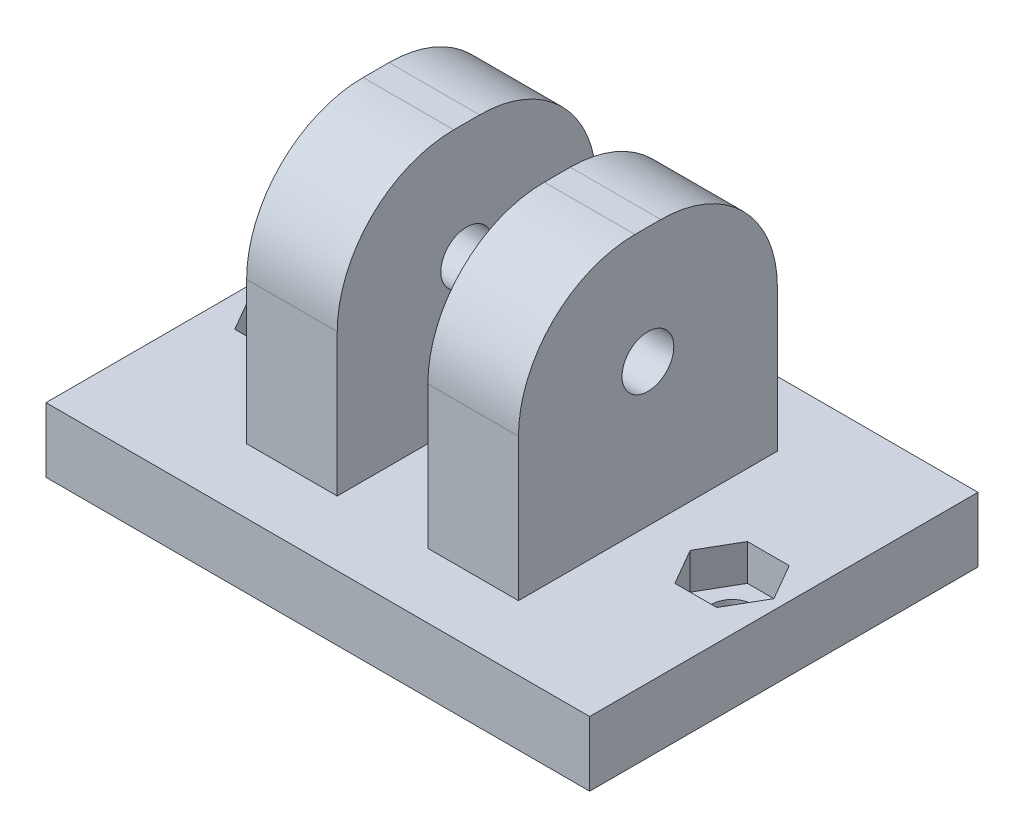
ISO-10303-21;
HEADER;
FILE_DESCRIPTION(('STEP AP214'),'2;1');
FILE_NAME('part.step','',(''),(''),'','','');
FILE_SCHEMA(('AUTOMOTIVE_DESIGN { 1 0 10303 214 1 1 1 1 }'));
ENDSEC;
DATA;
#1=APPLICATION_CONTEXT('core data for automotive mechanical design processes');
#2=APPLICATION_PROTOCOL_DEFINITION('international standard','automotive_design',2000,#1);
#3=PRODUCT_CONTEXT('',#1,'mechanical');
#4=PRODUCT('Part','Part','',(#3));
#5=PRODUCT_RELATED_PRODUCT_CATEGORY('part','',(#4));
#6=PRODUCT_DEFINITION_FORMATION('','',#4);
#7=PRODUCT_DEFINITION_CONTEXT('part definition',#1,'design');
#8=PRODUCT_DEFINITION('design','',#6,#7);
#9=PRODUCT_DEFINITION_SHAPE('','',#8);
#10=(LENGTH_UNIT() NAMED_UNIT(*) SI_UNIT(.MILLI.,.METRE.));
#11=(NAMED_UNIT(*) PLANE_ANGLE_UNIT() SI_UNIT($,.RADIAN.));
#12=(NAMED_UNIT(*) SI_UNIT($,.STERADIAN.) SOLID_ANGLE_UNIT());
#13=UNCERTAINTY_MEASURE_WITH_UNIT(LENGTH_MEASURE(1.E-05),#10,'distance_accuracy_value','');
#14=(GEOMETRIC_REPRESENTATION_CONTEXT(3) GLOBAL_UNCERTAINTY_ASSIGNED_CONTEXT((#13)) GLOBAL_UNIT_ASSIGNED_CONTEXT((#10,
#11,#12)) REPRESENTATION_CONTEXT('',''));
#15=CARTESIAN_POINT('',(0.,0.,0.));
#16=DIRECTION('',(0.,0.,1.));
#17=DIRECTION('',(1.,0.,0.));
#18=AXIS2_PLACEMENT_3D('',#15,#16,#17);
#19=CARTESIAN_POINT('',(-21.,5.,30.));
#20=DIRECTION('',(0.,-1.,0.));
#21=DIRECTION('',(0.,0.,-1.));
#22=AXIS2_PLACEMENT_3D('',#19,#20,#21);
#23=PLANE('',#22);
#24=DIRECTION('',(-1.,0.,0.));
#25=VECTOR('',#24,1.);
#26=CARTESIAN_POINT('',(3.5,5.,5.));
#27=LINE('',#26,#25);
#28=CARTESIAN_POINT('',(10.5,5.,5.));
#29=VERTEX_POINT('',#28);
#30=CARTESIAN_POINT('',(3.5,5.,5.));
#31=VERTEX_POINT('',#30);
#32=EDGE_CURVE('E250',#29,#31,#27,.T.);
#33=ORIENTED_EDGE('',*,*,#32,.F.);
#34=DIRECTION('',(0.,0.,-1.));
#35=VECTOR('',#34,1.);
#36=CARTESIAN_POINT('',(10.5,5.,25.));
#37=LINE('',#36,#35);
#38=CARTESIAN_POINT('',(10.5,5.,25.));
#39=VERTEX_POINT('',#38);
#40=EDGE_CURVE('E274',#39,#29,#37,.T.);
#41=ORIENTED_EDGE('',*,*,#40,.F.);
#42=DIRECTION('',(1.,0.,0.));
#43=VECTOR('',#42,1.);
#44=CARTESIAN_POINT('',(3.5,5.,25.));
#45=LINE('',#44,#43);
#46=CARTESIAN_POINT('',(3.5,5.,25.));
#47=VERTEX_POINT('',#46);
#48=EDGE_CURVE('E286',#47,#39,#45,.T.);
#49=ORIENTED_EDGE('',*,*,#48,.F.);
#50=DIRECTION('',(0.,0.,1.));
#51=VECTOR('',#50,1.);
#52=CARTESIAN_POINT('',(3.5,5.,25.));
#53=LINE('',#52,#51);
#54=EDGE_CURVE('E282',#31,#47,#53,.T.);
#55=ORIENTED_EDGE('',*,*,#54,.F.);
#56=EDGE_LOOP('',(#33,#41,#49,#55));
#57=FACE_BOUND('',#56,.T.);
#58=DIRECTION('',(0.5,0.,-0.866025403784438));
#59=VECTOR('',#58,1.);
#60=CARTESIAN_POINT('',(20.2331615074619,5.00000000000001,15.));
#61=LINE('',#60,#59);
#62=CARTESIAN_POINT('',(18.616580753731,5.,17.8));
#63=VERTEX_POINT('',#62);
#64=CARTESIAN_POINT('',(20.2331615074619,5.00000000000001,15.));
#65=VERTEX_POINT('',#64);
#66=EDGE_CURVE('E334',#63,#65,#61,.T.);
#67=ORIENTED_EDGE('',*,*,#66,.F.);
#68=DIRECTION('',(1.,0.,0.));
#69=VECTOR('',#68,1.);
#70=CARTESIAN_POINT('',(18.616580753731,5.00000000000001,17.8));
#71=LINE('',#70,#69);
#72=CARTESIAN_POINT('',(15.3834192462691,5.00000000000001,17.8));
#73=VERTEX_POINT('',#72);
#74=EDGE_CURVE('E331',#73,#63,#71,.T.);
#75=ORIENTED_EDGE('',*,*,#74,.F.);
#76=DIRECTION('',(0.5,0.,0.866025403784439));
#77=VECTOR('',#76,1.);
#78=CARTESIAN_POINT('',(15.3834192462691,5.00000000000001,17.8));
#79=LINE('',#78,#77);
#80=CARTESIAN_POINT('',(13.7668384925381,5.,15.));
#81=VERTEX_POINT('',#80);
#82=EDGE_CURVE('E310',#81,#73,#79,.T.);
#83=ORIENTED_EDGE('',*,*,#82,.F.);
#84=DIRECTION('',(-0.5,0.,0.866025403784439));
#85=VECTOR('',#84,1.);
#86=CARTESIAN_POINT('',(13.7668384925381,5.,15.));
#87=LINE('',#86,#85);
#88=CARTESIAN_POINT('',(15.3834192462691,5.00000000000001,12.2));
#89=VERTEX_POINT('',#88);
#90=EDGE_CURVE('E347',#89,#81,#87,.T.);
#91=ORIENTED_EDGE('',*,*,#90,.F.);
#92=DIRECTION('',(-1.,0.,0.));
#93=VECTOR('',#92,1.);
#94=CARTESIAN_POINT('',(15.3834192462691,5.00000000000001,12.2));
#95=LINE('',#94,#93);
#96=CARTESIAN_POINT('',(18.616580753731,5.00000000000001,12.2));
#97=VERTEX_POINT('',#96);
#98=EDGE_CURVE('E343',#97,#89,#95,.T.);
#99=ORIENTED_EDGE('',*,*,#98,.F.);
#100=DIRECTION('',(-0.5,0.,-0.866025403784439));
#101=VECTOR('',#100,1.);
#102=CARTESIAN_POINT('',(18.616580753731,5.00000000000001,12.2));
#103=LINE('',#102,#101);
#104=EDGE_CURVE('E339',#65,#97,#103,.T.);
#105=ORIENTED_EDGE('',*,*,#104,.F.);
#106=EDGE_LOOP('',(#67,#75,#83,#91,#99,#105));
#107=FACE_BOUND('',#106,.T.);
#108=DIRECTION('',(-0.5,0.,-0.866025403784439));
#109=VECTOR('',#108,1.);
#110=CARTESIAN_POINT('',(-13.7668384925381,5.,15.));
#111=LINE('',#110,#109);
#112=CARTESIAN_POINT('',(-13.7668384925381,5.,15.));
#113=VERTEX_POINT('',#112);
#114=CARTESIAN_POINT('',(-15.3834192462691,5.,12.2));
#115=VERTEX_POINT('',#114);
#116=EDGE_CURVE('E409',#113,#115,#111,.T.);
#117=ORIENTED_EDGE('',*,*,#116,.F.);
#118=DIRECTION('',(0.5,0.,-0.866025403784439));
#119=VECTOR('',#118,1.);
#120=CARTESIAN_POINT('',(-15.383419246269,5.,17.8));
#121=LINE('',#120,#119);
#122=CARTESIAN_POINT('',(-15.383419246269,5.,17.8));
#123=VERTEX_POINT('',#122);
#124=EDGE_CURVE('E335',#123,#113,#121,.T.);
#125=ORIENTED_EDGE('',*,*,#124,.F.);
#126=DIRECTION('',(1.,0.,0.));
#127=VECTOR('',#126,1.);
#128=CARTESIAN_POINT('',(-18.616580753731,5.,17.8));
#129=LINE('',#128,#127);
#130=CARTESIAN_POINT('',(-18.616580753731,5.,17.8));
#131=VERTEX_POINT('',#130);
#132=EDGE_CURVE('E392',#131,#123,#129,.T.);
#133=ORIENTED_EDGE('',*,*,#132,.F.);
#134=DIRECTION('',(0.5,0.,0.866025403784438));
#135=VECTOR('',#134,1.);
#136=CARTESIAN_POINT('',(-20.2331615074619,5.,15.));
#137=LINE('',#136,#135);
#138=CARTESIAN_POINT('',(-20.2331615074619,5.,15.));
#139=VERTEX_POINT('',#138);
#140=EDGE_CURVE('E396',#139,#131,#137,.T.);
#141=ORIENTED_EDGE('',*,*,#140,.F.);
#142=DIRECTION('',(-0.5,0.,0.866025403784439));
#143=VECTOR('',#142,1.);
#144=CARTESIAN_POINT('',(-18.616580753731,5.,12.2));
#145=LINE('',#144,#143);
#146=CARTESIAN_POINT('',(-18.616580753731,5.,12.2));
#147=VERTEX_POINT('',#146);
#148=EDGE_CURVE('E401',#147,#139,#145,.T.);
#149=ORIENTED_EDGE('',*,*,#148,.F.);
#150=DIRECTION('',(-1.,0.,0.));
#151=VECTOR('',#150,1.);
#152=CARTESIAN_POINT('',(-15.3834192462691,5.,12.2));
#153=LINE('',#152,#151);
#154=EDGE_CURVE('E405',#115,#147,#153,.T.);
#155=ORIENTED_EDGE('',*,*,#154,.F.);
#156=EDGE_LOOP('',(#117,#125,#133,#141,#149,#155));
#157=FACE_BOUND('',#156,.T.);
#158=DIRECTION('',(-1.,0.,0.));
#159=VECTOR('',#158,1.);
#160=CARTESIAN_POINT('',(-21.,5.,0.));
#161=LINE('',#160,#159);
#162=CARTESIAN_POINT('',(21.,5.,0.));
#163=VERTEX_POINT('',#162);
#164=CARTESIAN_POINT('',(-21.,5.,0.));
#165=VERTEX_POINT('',#164);
#166=EDGE_CURVE('E452',#163,#165,#161,.T.);
#167=ORIENTED_EDGE('',*,*,#166,.T.);
#168=DIRECTION('',(0.,0.,-1.));
#169=VECTOR('',#168,1.);
#170=CARTESIAN_POINT('',(-21.,5.,30.));
#171=LINE('',#170,#169);
#172=CARTESIAN_POINT('',(-21.,5.,30.));
#173=VERTEX_POINT('',#172);
#174=EDGE_CURVE('E461',#173,#165,#171,.T.);
#175=ORIENTED_EDGE('',*,*,#174,.F.);
#176=DIRECTION('',(-1.,0.,0.));
#177=VECTOR('',#176,1.);
#178=CARTESIAN_POINT('',(-21.,5.,30.));
#179=LINE('',#178,#177);
#180=CARTESIAN_POINT('',(21.,5.,30.));
#181=VERTEX_POINT('',#180);
#182=EDGE_CURVE('E458',#181,#173,#179,.T.);
#183=ORIENTED_EDGE('',*,*,#182,.F.);
#184=DIRECTION('',(0.,0.,-1.));
#185=VECTOR('',#184,1.);
#186=CARTESIAN_POINT('',(21.,5.,30.));
#187=LINE('',#186,#185);
#188=EDGE_CURVE('E476',#181,#163,#187,.T.);
#189=ORIENTED_EDGE('',*,*,#188,.T.);
#190=EDGE_LOOP('',(#167,#175,#183,#189));
#191=FACE_BOUND('',#190,.T.);
#192=DIRECTION('',(0.,0.,1.));
#193=VECTOR('',#192,1.);
#194=CARTESIAN_POINT('',(-10.5,5.,25.));
#195=LINE('',#194,#193);
#196=CARTESIAN_POINT('',(-10.5,5.,5.));
#197=VERTEX_POINT('',#196);
#198=CARTESIAN_POINT('',(-10.5,5.,25.));
#199=VERTEX_POINT('',#198);
#200=EDGE_CURVE('E234',#197,#199,#195,.T.);
#201=ORIENTED_EDGE('',*,*,#200,.F.);
#202=DIRECTION('',(-1.,0.,0.));
#203=VECTOR('',#202,1.);
#204=CARTESIAN_POINT('',(-10.5,5.,5.));
#205=LINE('',#204,#203);
#206=CARTESIAN_POINT('',(-3.50000000000001,5.,5.));
#207=VERTEX_POINT('',#206);
#208=EDGE_CURVE('E245',#207,#197,#205,.T.);
#209=ORIENTED_EDGE('',*,*,#208,.F.);
#210=DIRECTION('',(0.,0.,-1.));
#211=VECTOR('',#210,1.);
#212=CARTESIAN_POINT('',(-3.49999999999999,5.,25.));
#213=LINE('',#212,#211);
#214=CARTESIAN_POINT('',(-3.5,5.,25.));
#215=VERTEX_POINT('',#214);
#216=EDGE_CURVE('E254',#215,#207,#213,.T.);
#217=ORIENTED_EDGE('',*,*,#216,.F.);
#218=DIRECTION('',(1.,0.,0.));
#219=VECTOR('',#218,1.);
#220=CARTESIAN_POINT('',(-10.5,5.,25.));
#221=LINE('',#220,#219);
#222=EDGE_CURVE('E248',#199,#215,#221,.T.);
#223=ORIENTED_EDGE('',*,*,#222,.F.);
#224=EDGE_LOOP('',(#201,#209,#217,#223));
#225=FACE_BOUND('',#224,.T.);
#226=ADVANCED_FACE('F43',(#57,#107,#157,#191,#225),#23,.F.);
#227=CARTESIAN_POINT('',(-17.,20.,15.));
#228=DIRECTION('',(0.,-1.,0.));
#229=DIRECTION('',(1.,0.,0.));
#230=AXIS2_PLACEMENT_3D('',#227,#228,#229);
#231=CYLINDRICAL_SURFACE('',#230,1.6);
#232=CARTESIAN_POINT('',(-17.,0.,15.));
#233=DIRECTION('',(0.,1.,0.));
#234=DIRECTION('',(0.,0.,1.));
#235=AXIS2_PLACEMENT_3D('',#232,#233,#234);
#236=CIRCLE('',#235,1.6);
#237=CARTESIAN_POINT('',(-17.,0.,16.6));
#238=VERTEX_POINT('',#237);
#239=EDGE_CURVE('E441',#238,#238,#236,.F.);
#240=ORIENTED_EDGE('',*,*,#239,.T.);
#241=EDGE_LOOP('',(#240));
#242=FACE_BOUND('',#241,.T.);
#243=CARTESIAN_POINT('',(-17.,2.2,15.));
#244=DIRECTION('',(0.,1.,0.));
#245=DIRECTION('',(-1.,0.,0.));
#246=AXIS2_PLACEMENT_3D('',#243,#244,#245);
#247=CIRCLE('',#246,1.6);
#248=CARTESIAN_POINT('',(-18.6,2.2,15.));
#249=VERTEX_POINT('',#248);
#250=EDGE_CURVE('E357',#249,#249,#247,.T.);
#251=ORIENTED_EDGE('',*,*,#250,.T.);
#252=EDGE_LOOP('',(#251));
#253=FACE_BOUND('',#252,.T.);
#254=ADVANCED_FACE('F558',(#242,#253),#231,.F.);
#255=CARTESIAN_POINT('',(-21.,0.,30.));
#256=DIRECTION('',(1.,0.,0.));
#257=DIRECTION('',(0.,0.,-1.));
#258=AXIS2_PLACEMENT_3D('',#255,#256,#257);
#259=PLANE('',#258);
#260=DIRECTION('',(0.,-1.,0.));
#261=VECTOR('',#260,1.);
#262=CARTESIAN_POINT('',(-21.,0.,0.));
#263=LINE('',#262,#261);
#264=CARTESIAN_POINT('',(-21.,0.,0.));
#265=VERTEX_POINT('',#264);
#266=EDGE_CURVE('E446',#165,#265,#263,.T.);
#267=ORIENTED_EDGE('',*,*,#266,.T.);
#268=DIRECTION('',(0.,0.,-1.));
#269=VECTOR('',#268,1.);
#270=CARTESIAN_POINT('',(-21.,0.,30.));
#271=LINE('',#270,#269);
#272=CARTESIAN_POINT('',(-21.,0.,30.));
#273=VERTEX_POINT('',#272);
#274=EDGE_CURVE('E484',#273,#265,#271,.T.);
#275=ORIENTED_EDGE('',*,*,#274,.F.);
#276=DIRECTION('',(0.,-1.,0.));
#277=VECTOR('',#276,1.);
#278=CARTESIAN_POINT('',(-21.,0.,30.));
#279=LINE('',#278,#277);
#280=EDGE_CURVE('E447',#173,#273,#279,.T.);
#281=ORIENTED_EDGE('',*,*,#280,.F.);
#282=ORIENTED_EDGE('',*,*,#174,.T.);
#283=EDGE_LOOP('',(#267,#275,#281,#282));
#284=FACE_BOUND('',#283,.T.);
#285=ADVANCED_FACE('F564',(#284),#259,.F.);
#286=CARTESIAN_POINT('',(-21.,0.,30.));
#287=DIRECTION('',(0.,1.,0.));
#288=DIRECTION('',(0.,0.,1.));
#289=AXIS2_PLACEMENT_3D('',#286,#287,#288);
#290=PLANE('',#289);
#291=ORIENTED_EDGE('',*,*,#239,.F.);
#292=EDGE_LOOP('',(#291));
#293=FACE_BOUND('',#292,.T.);
#294=CARTESIAN_POINT('',(17.,0.,15.));
#295=DIRECTION('',(0.,1.,0.));
#296=DIRECTION('',(0.,0.,1.));
#297=AXIS2_PLACEMENT_3D('',#294,#295,#296);
#298=CIRCLE('',#297,1.6);
#299=CARTESIAN_POINT('',(17.,0.,16.6));
#300=VERTEX_POINT('',#299);
#301=EDGE_CURVE('E437',#300,#300,#298,.F.);
#302=ORIENTED_EDGE('',*,*,#301,.F.);
#303=EDGE_LOOP('',(#302));
#304=FACE_BOUND('',#303,.T.);
#305=DIRECTION('',(1.,0.,0.));
#306=VECTOR('',#305,1.);
#307=CARTESIAN_POINT('',(-21.,0.,0.));
#308=LINE('',#307,#306);
#309=CARTESIAN_POINT('',(21.,0.,0.));
#310=VERTEX_POINT('',#309);
#311=EDGE_CURVE('E465',#265,#310,#308,.T.);
#312=ORIENTED_EDGE('',*,*,#311,.T.);
#313=DIRECTION('',(0.,0.,-1.));
#314=VECTOR('',#313,1.);
#315=CARTESIAN_POINT('',(21.,0.,30.));
#316=LINE('',#315,#314);
#317=CARTESIAN_POINT('',(21.,0.,30.));
#318=VERTEX_POINT('',#317);
#319=EDGE_CURVE('E480',#318,#310,#316,.T.);
#320=ORIENTED_EDGE('',*,*,#319,.F.);
#321=DIRECTION('',(1.,0.,0.));
#322=VECTOR('',#321,1.);
#323=CARTESIAN_POINT('',(-21.,0.,30.));
#324=LINE('',#323,#322);
#325=EDGE_CURVE('E451',#273,#318,#324,.T.);
#326=ORIENTED_EDGE('',*,*,#325,.F.);
#327=ORIENTED_EDGE('',*,*,#274,.T.);
#328=EDGE_LOOP('',(#312,#320,#326,#327));
#329=FACE_BOUND('',#328,.T.);
#330=ADVANCED_FACE('F577',(#293,#304,#329),#290,.F.);
#331=CARTESIAN_POINT('',(21.,0.,30.));
#332=DIRECTION('',(-1.,0.,0.));
#333=DIRECTION('',(0.,0.,1.));
#334=AXIS2_PLACEMENT_3D('',#331,#332,#333);
#335=PLANE('',#334);
#336=DIRECTION('',(0.,1.,0.));
#337=VECTOR('',#336,1.);
#338=CARTESIAN_POINT('',(21.,0.,0.));
#339=LINE('',#338,#337);
#340=EDGE_CURVE('E468',#310,#163,#339,.T.);
#341=ORIENTED_EDGE('',*,*,#340,.T.);
#342=ORIENTED_EDGE('',*,*,#188,.F.);
#343=DIRECTION('',(0.,1.,0.));
#344=VECTOR('',#343,1.);
#345=CARTESIAN_POINT('',(21.,0.,30.));
#346=LINE('',#345,#344);
#347=EDGE_CURVE('E455',#318,#181,#346,.T.);
#348=ORIENTED_EDGE('',*,*,#347,.F.);
#349=ORIENTED_EDGE('',*,*,#319,.T.);
#350=EDGE_LOOP('',(#341,#342,#348,#349));
#351=FACE_BOUND('',#350,.T.);
#352=ADVANCED_FACE('F573',(#351),#335,.F.);
#353=CARTESIAN_POINT('',(0.,0.,30.));
#354=DIRECTION('',(0.,0.,-1.));
#355=DIRECTION('',(-1.,0.,0.));
#356=AXIS2_PLACEMENT_3D('',#353,#354,#355);
#357=PLANE('',#356);
#358=ORIENTED_EDGE('',*,*,#280,.T.);
#359=ORIENTED_EDGE('',*,*,#325,.T.);
#360=ORIENTED_EDGE('',*,*,#347,.T.);
#361=ORIENTED_EDGE('',*,*,#182,.T.);
#362=EDGE_LOOP('',(#358,#359,#360,#361));
#363=FACE_BOUND('',#362,.T.);
#364=ADVANCED_FACE('F576',(#363),#357,.F.);
#365=CARTESIAN_POINT('',(0.,0.,0.));
#366=DIRECTION('',(0.,0.,-1.));
#367=DIRECTION('',(-1.,0.,0.));
#368=AXIS2_PLACEMENT_3D('',#365,#366,#367);
#369=PLANE('',#368);
#370=ORIENTED_EDGE('',*,*,#266,.F.);
#371=ORIENTED_EDGE('',*,*,#166,.F.);
#372=ORIENTED_EDGE('',*,*,#340,.F.);
#373=ORIENTED_EDGE('',*,*,#311,.F.);
#374=EDGE_LOOP('',(#370,#371,#372,#373));
#375=FACE_BOUND('',#374,.T.);
#376=ADVANCED_FACE('F571',(#375),#369,.T.);
#377=CARTESIAN_POINT('',(17.,20.,15.));
#378=DIRECTION('',(0.,-1.,0.));
#379=DIRECTION('',(1.,0.,0.));
#380=AXIS2_PLACEMENT_3D('',#377,#378,#379);
#381=CYLINDRICAL_SURFACE('',#380,1.6);
#382=CARTESIAN_POINT('',(17.,2.2,15.));
#383=DIRECTION('',(0.,-1.,0.));
#384=DIRECTION('',(0.,0.,-1.));
#385=AXIS2_PLACEMENT_3D('',#382,#383,#384);
#386=CIRCLE('',#385,1.6);
#387=CARTESIAN_POINT('',(17.,2.2,13.4));
#388=VERTEX_POINT('',#387);
#389=EDGE_CURVE('E442',#388,#388,#386,.T.);
#390=ORIENTED_EDGE('',*,*,#389,.F.);
#391=EDGE_LOOP('',(#390));
#392=FACE_BOUND('',#391,.T.);
#393=ORIENTED_EDGE('',*,*,#301,.T.);
#394=EDGE_LOOP('',(#393));
#395=FACE_BOUND('',#394,.T.);
#396=ADVANCED_FACE('F663',(#392,#395),#381,.F.);
#397=CARTESIAN_POINT('',(-15.383419246269,2.2,17.8));
#398=DIRECTION('',(0.866025403784439,0.,0.5));
#399=DIRECTION('',(0.5,0.,-0.866025403784439));
#400=AXIS2_PLACEMENT_3D('',#397,#398,#399);
#401=PLANE('',#400);
#402=ORIENTED_EDGE('',*,*,#124,.T.);
#403=DIRECTION('',(0.,1.,0.));
#404=VECTOR('',#403,1.);
#405=CARTESIAN_POINT('',(-13.7668384925381,2.2,15.));
#406=LINE('',#405,#404);
#407=CARTESIAN_POINT('',(-13.7668384925381,2.2,15.));
#408=VERTEX_POINT('',#407);
#409=EDGE_CURVE('E373',#408,#113,#406,.T.);
#410=ORIENTED_EDGE('',*,*,#409,.F.);
#411=DIRECTION('',(0.5,0.,-0.866025403784439));
#412=VECTOR('',#411,1.);
#413=CARTESIAN_POINT('',(-15.383419246269,2.2,17.8));
#414=LINE('',#413,#412);
#415=CARTESIAN_POINT('',(-15.383419246269,2.2,17.8));
#416=VERTEX_POINT('',#415);
#417=EDGE_CURVE('E397',#416,#408,#414,.T.);
#418=ORIENTED_EDGE('',*,*,#417,.F.);
#419=DIRECTION('',(0.,1.,0.));
#420=VECTOR('',#419,1.);
#421=CARTESIAN_POINT('',(-15.383419246269,2.2,17.8));
#422=LINE('',#421,#420);
#423=EDGE_CURVE('E304',#416,#123,#422,.T.);
#424=ORIENTED_EDGE('',*,*,#423,.T.);
#425=EDGE_LOOP('',(#402,#410,#418,#424));
#426=FACE_BOUND('',#425,.T.);
#427=ADVANCED_FACE('F659',(#426),#401,.F.);
#428=CARTESIAN_POINT('',(-18.616580753731,2.2,17.8));
#429=DIRECTION('',(0.,0.,1.));
#430=DIRECTION('',(1.,0.,0.));
#431=AXIS2_PLACEMENT_3D('',#428,#429,#430);
#432=PLANE('',#431);
#433=ORIENTED_EDGE('',*,*,#132,.T.);
#434=ORIENTED_EDGE('',*,*,#423,.F.);
#435=DIRECTION('',(1.,0.,0.));
#436=VECTOR('',#435,1.);
#437=CARTESIAN_POINT('',(-18.616580753731,2.2,17.8));
#438=LINE('',#437,#436);
#439=CARTESIAN_POINT('',(-18.616580753731,2.2,17.8));
#440=VERTEX_POINT('',#439);
#441=EDGE_CURVE('E377',#440,#416,#438,.T.);
#442=ORIENTED_EDGE('',*,*,#441,.F.);
#443=DIRECTION('',(0.,1.,0.));
#444=VECTOR('',#443,1.);
#445=CARTESIAN_POINT('',(-18.616580753731,2.2,17.8));
#446=LINE('',#445,#444);
#447=EDGE_CURVE('E387',#440,#131,#446,.T.);
#448=ORIENTED_EDGE('',*,*,#447,.T.);
#449=EDGE_LOOP('',(#433,#434,#442,#448));
#450=FACE_BOUND('',#449,.T.);
#451=ADVANCED_FACE('F662',(#450),#432,.F.);
#452=CARTESIAN_POINT('',(-20.2331615074619,2.2,15.));
#453=DIRECTION('',(-0.866025403784439,0.,0.5));
#454=DIRECTION('',(0.5,0.,0.866025403784439));
#455=AXIS2_PLACEMENT_3D('',#452,#453,#454);
#456=PLANE('',#455);
#457=ORIENTED_EDGE('',*,*,#140,.T.);
#458=ORIENTED_EDGE('',*,*,#447,.F.);
#459=DIRECTION('',(0.5,0.,0.866025403784438));
#460=VECTOR('',#459,1.);
#461=CARTESIAN_POINT('',(-20.2331615074619,2.2,15.));
#462=LINE('',#461,#460);
#463=CARTESIAN_POINT('',(-20.2331615074619,2.2,15.));
#464=VERTEX_POINT('',#463);
#465=EDGE_CURVE('E418',#464,#440,#462,.T.);
#466=ORIENTED_EDGE('',*,*,#465,.F.);
#467=DIRECTION('',(0.,1.,0.));
#468=VECTOR('',#467,1.);
#469=CARTESIAN_POINT('',(-20.2331615074619,2.2,15.));
#470=LINE('',#469,#468);
#471=EDGE_CURVE('E384',#464,#139,#470,.T.);
#472=ORIENTED_EDGE('',*,*,#471,.T.);
#473=EDGE_LOOP('',(#457,#458,#466,#472));
#474=FACE_BOUND('',#473,.T.);
#475=ADVANCED_FACE('F676',(#474),#456,.F.);
#476=CARTESIAN_POINT('',(-18.616580753731,2.2,12.2));
#477=DIRECTION('',(-0.866025403784439,0.,-0.5));
#478=DIRECTION('',(-0.5,0.,0.866025403784439));
#479=AXIS2_PLACEMENT_3D('',#476,#477,#478);
#480=PLANE('',#479);
#481=ORIENTED_EDGE('',*,*,#148,.T.);
#482=ORIENTED_EDGE('',*,*,#471,.F.);
#483=DIRECTION('',(-0.5,0.,0.866025403784439));
#484=VECTOR('',#483,1.);
#485=CARTESIAN_POINT('',(-18.616580753731,2.2,12.2));
#486=LINE('',#485,#484);
#487=CARTESIAN_POINT('',(-18.616580753731,2.2,12.2));
#488=VERTEX_POINT('',#487);
#489=EDGE_CURVE('E422',#488,#464,#486,.T.);
#490=ORIENTED_EDGE('',*,*,#489,.F.);
#491=DIRECTION('',(0.,1.,0.));
#492=VECTOR('',#491,1.);
#493=CARTESIAN_POINT('',(-18.616580753731,2.2,12.2));
#494=LINE('',#493,#492);
#495=EDGE_CURVE('E381',#488,#147,#494,.T.);
#496=ORIENTED_EDGE('',*,*,#495,.T.);
#497=EDGE_LOOP('',(#481,#482,#490,#496));
#498=FACE_BOUND('',#497,.T.);
#499=ADVANCED_FACE('F672',(#498),#480,.F.);
#500=CARTESIAN_POINT('',(-15.3834192462691,2.2,12.2));
#501=DIRECTION('',(0.,0.,-1.));
#502=DIRECTION('',(-1.,0.,0.));
#503=AXIS2_PLACEMENT_3D('',#500,#501,#502);
#504=PLANE('',#503);
#505=ORIENTED_EDGE('',*,*,#154,.T.);
#506=ORIENTED_EDGE('',*,*,#495,.F.);
#507=DIRECTION('',(-1.,0.,0.));
#508=VECTOR('',#507,1.);
#509=CARTESIAN_POINT('',(-15.3834192462691,2.2,12.2));
#510=LINE('',#509,#508);
#511=CARTESIAN_POINT('',(-15.3834192462691,2.2,12.2));
#512=VERTEX_POINT('',#511);
#513=EDGE_CURVE('E426',#512,#488,#510,.T.);
#514=ORIENTED_EDGE('',*,*,#513,.F.);
#515=DIRECTION('',(0.,1.,0.));
#516=VECTOR('',#515,1.);
#517=CARTESIAN_POINT('',(-15.3834192462691,2.2,12.2));
#518=LINE('',#517,#516);
#519=EDGE_CURVE('E378',#512,#115,#518,.T.);
#520=ORIENTED_EDGE('',*,*,#519,.T.);
#521=EDGE_LOOP('',(#505,#506,#514,#520));
#522=FACE_BOUND('',#521,.T.);
#523=ADVANCED_FACE('F668',(#522),#504,.F.);
#524=CARTESIAN_POINT('',(-13.7668384925381,2.2,15.));
#525=DIRECTION('',(0.866025403784438,0.,-0.5));
#526=DIRECTION('',(-0.5,0.,-0.866025403784439));
#527=AXIS2_PLACEMENT_3D('',#524,#525,#526);
#528=PLANE('',#527);
#529=ORIENTED_EDGE('',*,*,#116,.T.);
#530=ORIENTED_EDGE('',*,*,#519,.F.);
#531=DIRECTION('',(-0.5,0.,-0.866025403784439));
#532=VECTOR('',#531,1.);
#533=CARTESIAN_POINT('',(-13.7668384925381,2.2,15.));
#534=LINE('',#533,#532);
#535=EDGE_CURVE('E430',#408,#512,#534,.T.);
#536=ORIENTED_EDGE('',*,*,#535,.F.);
#537=ORIENTED_EDGE('',*,*,#409,.T.);
#538=EDGE_LOOP('',(#529,#530,#536,#537));
#539=FACE_BOUND('',#538,.T.);
#540=ADVANCED_FACE('F665',(#539),#528,.F.);
#541=CARTESIAN_POINT('',(0.,2.20000000000001,0.));
#542=DIRECTION('',(0.,1.,0.));
#543=DIRECTION('',(-1.,0.,0.));
#544=AXIS2_PLACEMENT_3D('',#541,#542,#543);
#545=PLANE('',#544);
#546=ORIENTED_EDGE('',*,*,#250,.F.);
#547=EDGE_LOOP('',(#546));
#548=FACE_BOUND('',#547,.T.);
#549=ORIENTED_EDGE('',*,*,#417,.T.);
#550=ORIENTED_EDGE('',*,*,#535,.T.);
#551=ORIENTED_EDGE('',*,*,#513,.T.);
#552=ORIENTED_EDGE('',*,*,#489,.T.);
#553=ORIENTED_EDGE('',*,*,#465,.T.);
#554=ORIENTED_EDGE('',*,*,#441,.T.);
#555=EDGE_LOOP('',(#549,#550,#551,#552,#553,#554));
#556=FACE_BOUND('',#555,.T.);
#557=ADVANCED_FACE('F657',(#548,#556),#545,.T.);
#558=CARTESIAN_POINT('',(18.616580753731,2.20000000000001,17.8));
#559=DIRECTION('',(0.,0.,1.));
#560=DIRECTION('',(1.,0.,0.));
#561=AXIS2_PLACEMENT_3D('',#558,#559,#560);
#562=PLANE('',#561);
#563=ORIENTED_EDGE('',*,*,#74,.T.);
#564=DIRECTION('',(0.,1.,0.));
#565=VECTOR('',#564,1.);
#566=CARTESIAN_POINT('',(18.616580753731,2.20000000000001,17.8));
#567=LINE('',#566,#565);
#568=CARTESIAN_POINT('',(18.616580753731,2.20000000000001,17.8));
#569=VERTEX_POINT('',#568);
#570=EDGE_CURVE('E330',#569,#63,#567,.T.);
#571=ORIENTED_EDGE('',*,*,#570,.F.);
#572=DIRECTION('',(1.,0.,0.));
#573=VECTOR('',#572,1.);
#574=CARTESIAN_POINT('',(18.616580753731,2.20000000000001,17.8));
#575=LINE('',#574,#573);
#576=CARTESIAN_POINT('',(15.3834192462691,2.20000000000001,17.8));
#577=VERTEX_POINT('',#576);
#578=EDGE_CURVE('E305',#577,#569,#575,.T.);
#579=ORIENTED_EDGE('',*,*,#578,.F.);
#580=DIRECTION('',(0.,1.,0.));
#581=VECTOR('',#580,1.);
#582=CARTESIAN_POINT('',(15.3834192462691,2.20000000000001,17.8));
#583=LINE('',#582,#581);
#584=EDGE_CURVE('E354',#577,#73,#583,.T.);
#585=ORIENTED_EDGE('',*,*,#584,.T.);
#586=EDGE_LOOP('',(#563,#571,#579,#585));
#587=FACE_BOUND('',#586,.T.);
#588=ADVANCED_FACE('F639',(#587),#562,.F.);
#589=CARTESIAN_POINT('',(15.3834192462691,2.20000000000001,17.8));
#590=DIRECTION('',(-0.866025403784439,0.,0.5));
#591=DIRECTION('',(0.5,0.,0.866025403784439));
#592=AXIS2_PLACEMENT_3D('',#589,#590,#591);
#593=PLANE('',#592);
#594=ORIENTED_EDGE('',*,*,#82,.T.);
#595=ORIENTED_EDGE('',*,*,#584,.F.);
#596=DIRECTION('',(0.5,0.,0.866025403784439));
#597=VECTOR('',#596,1.);
#598=CARTESIAN_POINT('',(15.3834192462691,2.20000000000001,17.8));
#599=LINE('',#598,#597);
#600=CARTESIAN_POINT('',(13.7668384925381,2.2,15.));
#601=VERTEX_POINT('',#600);
#602=EDGE_CURVE('E326',#601,#577,#599,.T.);
#603=ORIENTED_EDGE('',*,*,#602,.F.);
#604=DIRECTION('',(0.,1.,0.));
#605=VECTOR('',#604,1.);
#606=CARTESIAN_POINT('',(13.7668384925381,2.2,15.));
#607=LINE('',#606,#605);
#608=EDGE_CURVE('E358',#601,#81,#607,.T.);
#609=ORIENTED_EDGE('',*,*,#608,.T.);
#610=EDGE_LOOP('',(#594,#595,#603,#609));
#611=FACE_BOUND('',#610,.T.);
#612=ADVANCED_FACE('F635',(#611),#593,.F.);
#613=CARTESIAN_POINT('',(13.7668384925381,2.2,15.));
#614=DIRECTION('',(-0.866025403784438,0.,-0.5));
#615=DIRECTION('',(-0.5,0.,0.866025403784439));
#616=AXIS2_PLACEMENT_3D('',#613,#614,#615);
#617=PLANE('',#616);
#618=ORIENTED_EDGE('',*,*,#90,.T.);
#619=ORIENTED_EDGE('',*,*,#608,.F.);
#620=DIRECTION('',(-0.5,0.,0.866025403784439));
#621=VECTOR('',#620,1.);
#622=CARTESIAN_POINT('',(13.7668384925381,2.2,15.));
#623=LINE('',#622,#621);
#624=CARTESIAN_POINT('',(15.3834192462691,2.20000000000001,12.2));
#625=VERTEX_POINT('',#624);
#626=EDGE_CURVE('E322',#625,#601,#623,.T.);
#627=ORIENTED_EDGE('',*,*,#626,.F.);
#628=DIRECTION('',(0.,1.,0.));
#629=VECTOR('',#628,1.);
#630=CARTESIAN_POINT('',(15.3834192462691,2.20000000000001,12.2));
#631=LINE('',#630,#629);
#632=EDGE_CURVE('E361',#625,#89,#631,.T.);
#633=ORIENTED_EDGE('',*,*,#632,.T.);
#634=EDGE_LOOP('',(#618,#619,#627,#633));
#635=FACE_BOUND('',#634,.T.);
#636=ADVANCED_FACE('F638',(#635),#617,.F.);
#637=CARTESIAN_POINT('',(15.3834192462691,2.20000000000001,12.2));
#638=DIRECTION('',(0.,0.,-1.));
#639=DIRECTION('',(-1.,0.,0.));
#640=AXIS2_PLACEMENT_3D('',#637,#638,#639);
#641=PLANE('',#640);
#642=ORIENTED_EDGE('',*,*,#98,.T.);
#643=ORIENTED_EDGE('',*,*,#632,.F.);
#644=DIRECTION('',(-1.,0.,0.));
#645=VECTOR('',#644,1.);
#646=CARTESIAN_POINT('',(15.3834192462691,2.20000000000001,12.2));
#647=LINE('',#646,#645);
#648=CARTESIAN_POINT('',(18.616580753731,2.20000000000001,12.2));
#649=VERTEX_POINT('',#648);
#650=EDGE_CURVE('E318',#649,#625,#647,.T.);
#651=ORIENTED_EDGE('',*,*,#650,.F.);
#652=DIRECTION('',(0.,1.,0.));
#653=VECTOR('',#652,1.);
#654=CARTESIAN_POINT('',(18.616580753731,2.20000000000001,12.2));
#655=LINE('',#654,#653);
#656=EDGE_CURVE('E364',#649,#97,#655,.T.);
#657=ORIENTED_EDGE('',*,*,#656,.T.);
#658=EDGE_LOOP('',(#642,#643,#651,#657));
#659=FACE_BOUND('',#658,.T.);
#660=ADVANCED_FACE('F643',(#659),#641,.F.);
#661=CARTESIAN_POINT('',(18.616580753731,2.20000000000001,12.2));
#662=DIRECTION('',(0.866025403784439,0.,-0.5));
#663=DIRECTION('',(-0.5,0.,-0.866025403784439));
#664=AXIS2_PLACEMENT_3D('',#661,#662,#663);
#665=PLANE('',#664);
#666=ORIENTED_EDGE('',*,*,#104,.T.);
#667=ORIENTED_EDGE('',*,*,#656,.F.);
#668=DIRECTION('',(-0.5,0.,-0.866025403784439));
#669=VECTOR('',#668,1.);
#670=CARTESIAN_POINT('',(18.616580753731,2.20000000000001,12.2));
#671=LINE('',#670,#669);
#672=CARTESIAN_POINT('',(20.2331615074619,2.20000000000001,15.));
#673=VERTEX_POINT('',#672);
#674=EDGE_CURVE('E314',#673,#649,#671,.T.);
#675=ORIENTED_EDGE('',*,*,#674,.F.);
#676=DIRECTION('',(0.,1.,0.));
#677=VECTOR('',#676,1.);
#678=CARTESIAN_POINT('',(20.2331615074619,2.20000000000001,15.));
#679=LINE('',#678,#677);
#680=EDGE_CURVE('E367',#673,#65,#679,.T.);
#681=ORIENTED_EDGE('',*,*,#680,.T.);
#682=EDGE_LOOP('',(#666,#667,#675,#681));
#683=FACE_BOUND('',#682,.T.);
#684=ADVANCED_FACE('F647',(#683),#665,.F.);
#685=CARTESIAN_POINT('',(20.2331615074619,2.20000000000001,15.));
#686=DIRECTION('',(0.866025403784439,0.,0.5));
#687=DIRECTION('',(0.5,0.,-0.866025403784439));
#688=AXIS2_PLACEMENT_3D('',#685,#686,#687);
#689=PLANE('',#688);
#690=ORIENTED_EDGE('',*,*,#66,.T.);
#691=ORIENTED_EDGE('',*,*,#680,.F.);
#692=DIRECTION('',(0.5,0.,-0.866025403784438));
#693=VECTOR('',#692,1.);
#694=CARTESIAN_POINT('',(20.2331615074619,2.20000000000001,15.));
#695=LINE('',#694,#693);
#696=EDGE_CURVE('E309',#569,#673,#695,.T.);
#697=ORIENTED_EDGE('',*,*,#696,.F.);
#698=ORIENTED_EDGE('',*,*,#570,.T.);
#699=EDGE_LOOP('',(#690,#691,#697,#698));
#700=FACE_BOUND('',#699,.T.);
#701=ADVANCED_FACE('F633',(#700),#689,.F.);
#702=CARTESIAN_POINT('',(0.,2.2,0.));
#703=DIRECTION('',(0.,-1.,0.));
#704=DIRECTION('',(0.,0.,-1.));
#705=AXIS2_PLACEMENT_3D('',#702,#703,#704);
#706=PLANE('',#705);
#707=ORIENTED_EDGE('',*,*,#389,.T.);
#708=EDGE_LOOP('',(#707));
#709=FACE_BOUND('',#708,.T.);
#710=ORIENTED_EDGE('',*,*,#578,.T.);
#711=ORIENTED_EDGE('',*,*,#696,.T.);
#712=ORIENTED_EDGE('',*,*,#674,.T.);
#713=ORIENTED_EDGE('',*,*,#650,.T.);
#714=ORIENTED_EDGE('',*,*,#626,.T.);
#715=ORIENTED_EDGE('',*,*,#602,.T.);
#716=EDGE_LOOP('',(#710,#711,#712,#713,#714,#715));
#717=FACE_BOUND('',#716,.T.);
#718=ADVANCED_FACE('F630',(#709,#717),#706,.F.);
#719=CARTESIAN_POINT('',(3.5,25.,5.));
#720=DIRECTION('',(0.,0.,1.));
#721=DIRECTION('',(1.,0.,0.));
#722=AXIS2_PLACEMENT_3D('',#719,#720,#721);
#723=PLANE('',#722);
#724=DIRECTION('',(0.,-1.,0.));
#725=VECTOR('',#724,1.);
#726=CARTESIAN_POINT('',(3.5,25.,5.));
#727=LINE('',#726,#725);
#728=CARTESIAN_POINT('',(3.5,16.,5.));
#729=VERTEX_POINT('',#728);
#730=EDGE_CURVE('E301',#729,#31,#727,.T.);
#731=ORIENTED_EDGE('',*,*,#730,.F.);
#732=DIRECTION('',(-1.,0.,0.));
#733=VECTOR('',#732,1.);
#734=CARTESIAN_POINT('',(10.5,16.,5.));
#735=LINE('',#734,#733);
#736=CARTESIAN_POINT('',(10.5,16.,5.));
#737=VERTEX_POINT('',#736);
#738=EDGE_CURVE('E517',#729,#737,#735,.F.);
#739=ORIENTED_EDGE('',*,*,#738,.T.);
#740=DIRECTION('',(0.,-1.,0.));
#741=VECTOR('',#740,1.);
#742=CARTESIAN_POINT('',(10.5,25.,5.));
#743=LINE('',#742,#741);
#744=EDGE_CURVE('E278',#737,#29,#743,.T.);
#745=ORIENTED_EDGE('',*,*,#744,.T.);
#746=ORIENTED_EDGE('',*,*,#32,.T.);
#747=EDGE_LOOP('',(#731,#739,#745,#746));
#748=FACE_BOUND('',#747,.T.);
#749=ADVANCED_FACE('F607',(#748),#723,.F.);
#750=CARTESIAN_POINT('',(3.5,25.,25.));
#751=DIRECTION('',(1.,0.,0.));
#752=DIRECTION('',(0.,0.,-1.));
#753=AXIS2_PLACEMENT_3D('',#750,#751,#752);
#754=PLANE('',#753);
#755=CARTESIAN_POINT('',(3.5,16.,15.));
#756=DIRECTION('',(1.,0.,0.));
#757=DIRECTION('',(0.,0.,-1.));
#758=AXIS2_PLACEMENT_3D('',#755,#756,#757);
#759=CIRCLE('',#758,2.);
#760=CARTESIAN_POINT('',(3.5,16.,13.));
#761=VERTEX_POINT('',#760);
#762=EDGE_CURVE('E1026',#761,#761,#759,.F.);
#763=ORIENTED_EDGE('',*,*,#762,.F.);
#764=EDGE_LOOP('',(#763));
#765=FACE_BOUND('',#764,.T.);
#766=DIRECTION('',(0.,-1.,0.));
#767=VECTOR('',#766,1.);
#768=CARTESIAN_POINT('',(3.5,25.,25.));
#769=LINE('',#768,#767);
#770=CARTESIAN_POINT('',(3.5,16.,25.));
#771=VERTEX_POINT('',#770);
#772=EDGE_CURVE('E298',#771,#47,#769,.T.);
#773=ORIENTED_EDGE('',*,*,#772,.F.);
#774=CARTESIAN_POINT('',(3.5,16.,16.));
#775=DIRECTION('',(1.,0.,0.));
#776=DIRECTION('',(0.,0.,-1.));
#777=AXIS2_PLACEMENT_3D('',#774,#775,#776);
#778=CIRCLE('',#777,9.);
#779=CARTESIAN_POINT('',(3.5,25.,16.));
#780=VERTEX_POINT('',#779);
#781=EDGE_CURVE('E514',#771,#780,#778,.F.);
#782=ORIENTED_EDGE('',*,*,#781,.T.);
#783=DIRECTION('',(0.,0.,1.));
#784=VECTOR('',#783,1.);
#785=CARTESIAN_POINT('',(3.5,25.,25.));
#786=LINE('',#785,#784);
#787=CARTESIAN_POINT('',(3.5,25.,14.));
#788=VERTEX_POINT('',#787);
#789=EDGE_CURVE('E269',#788,#780,#786,.T.);
#790=ORIENTED_EDGE('',*,*,#789,.F.);
#791=CARTESIAN_POINT('',(3.5,16.,14.));
#792=DIRECTION('',(1.,0.,0.));
#793=DIRECTION('',(0.,0.,-1.));
#794=AXIS2_PLACEMENT_3D('',#791,#792,#793);
#795=CIRCLE('',#794,9.);
#796=EDGE_CURVE('E511',#788,#729,#795,.F.);
#797=ORIENTED_EDGE('',*,*,#796,.T.);
#798=ORIENTED_EDGE('',*,*,#730,.T.);
#799=ORIENTED_EDGE('',*,*,#54,.T.);
#800=EDGE_LOOP('',(#773,#782,#790,#797,#798,#799));
#801=FACE_BOUND('',#800,.T.);
#802=ADVANCED_FACE('F597',(#765,#801),#754,.F.);
#803=CARTESIAN_POINT('',(3.5,25.,25.));
#804=DIRECTION('',(0.,0.,-1.));
#805=DIRECTION('',(-1.,0.,0.));
#806=AXIS2_PLACEMENT_3D('',#803,#804,#805);
#807=PLANE('',#806);
#808=DIRECTION('',(0.,-1.,0.));
#809=VECTOR('',#808,1.);
#810=CARTESIAN_POINT('',(10.5,25.,25.));
#811=LINE('',#810,#809);
#812=CARTESIAN_POINT('',(10.5,16.,25.));
#813=VERTEX_POINT('',#812);
#814=EDGE_CURVE('E295',#813,#39,#811,.T.);
#815=ORIENTED_EDGE('',*,*,#814,.F.);
#816=DIRECTION('',(1.,0.,0.));
#817=VECTOR('',#816,1.);
#818=CARTESIAN_POINT('',(3.5,16.,25.));
#819=LINE('',#818,#817);
#820=EDGE_CURVE('E508',#813,#771,#819,.F.);
#821=ORIENTED_EDGE('',*,*,#820,.T.);
#822=ORIENTED_EDGE('',*,*,#772,.T.);
#823=ORIENTED_EDGE('',*,*,#48,.T.);
#824=EDGE_LOOP('',(#815,#821,#822,#823));
#825=FACE_BOUND('',#824,.T.);
#826=ADVANCED_FACE('F615',(#825),#807,.F.);
#827=CARTESIAN_POINT('',(10.5,25.,25.));
#828=DIRECTION('',(-1.,0.,0.));
#829=DIRECTION('',(0.,-1.,0.));
#830=AXIS2_PLACEMENT_3D('',#827,#828,#829);
#831=PLANE('',#830);
#832=CARTESIAN_POINT('',(10.5,16.,15.));
#833=DIRECTION('',(-1.,0.,0.));
#834=DIRECTION('',(0.,-1.,0.));
#835=AXIS2_PLACEMENT_3D('',#832,#833,#834);
#836=CIRCLE('',#835,2.);
#837=CARTESIAN_POINT('',(10.5,14.,15.));
#838=VERTEX_POINT('',#837);
#839=EDGE_CURVE('E1030',#838,#838,#836,.F.);
#840=ORIENTED_EDGE('',*,*,#839,.F.);
#841=EDGE_LOOP('',(#840));
#842=FACE_BOUND('',#841,.T.);
#843=DIRECTION('',(0.,0.,-1.));
#844=VECTOR('',#843,1.);
#845=CARTESIAN_POINT('',(10.5,25.,25.));
#846=LINE('',#845,#844);
#847=CARTESIAN_POINT('',(10.5,25.,16.));
#848=VERTEX_POINT('',#847);
#849=CARTESIAN_POINT('',(10.5,25.,14.));
#850=VERTEX_POINT('',#849);
#851=EDGE_CURVE('E273',#848,#850,#846,.T.);
#852=ORIENTED_EDGE('',*,*,#851,.F.);
#853=CARTESIAN_POINT('',(10.5,16.,16.));
#854=DIRECTION('',(-1.,0.,0.));
#855=DIRECTION('',(0.,-1.,0.));
#856=AXIS2_PLACEMENT_3D('',#853,#854,#855);
#857=CIRCLE('',#856,9.);
#858=EDGE_CURVE('E505',#848,#813,#857,.F.);
#859=ORIENTED_EDGE('',*,*,#858,.T.);
#860=ORIENTED_EDGE('',*,*,#814,.T.);
#861=ORIENTED_EDGE('',*,*,#40,.T.);
#862=ORIENTED_EDGE('',*,*,#744,.F.);
#863=CARTESIAN_POINT('',(10.5,16.,14.));
#864=DIRECTION('',(-1.,0.,0.));
#865=DIRECTION('',(0.,-1.,0.));
#866=AXIS2_PLACEMENT_3D('',#863,#864,#865);
#867=CIRCLE('',#866,9.);
#868=EDGE_CURVE('E502',#737,#850,#867,.F.);
#869=ORIENTED_EDGE('',*,*,#868,.T.);
#870=EDGE_LOOP('',(#852,#859,#860,#861,#862,#869));
#871=FACE_BOUND('',#870,.T.);
#872=ADVANCED_FACE('F612',(#842,#871),#831,.F.);
#873=CARTESIAN_POINT('',(0.,25.,0.));
#874=DIRECTION('',(0.,1.,0.));
#875=DIRECTION('',(0.,0.,1.));
#876=AXIS2_PLACEMENT_3D('',#873,#874,#875);
#877=PLANE('',#876);
#878=ORIENTED_EDGE('',*,*,#789,.T.);
#879=DIRECTION('',(1.,0.,0.));
#880=VECTOR('',#879,1.);
#881=CARTESIAN_POINT('',(10.5,25.,16.));
#882=LINE('',#881,#880);
#883=EDGE_CURVE('E498',#780,#848,#882,.T.);
#884=ORIENTED_EDGE('',*,*,#883,.T.);
#885=ORIENTED_EDGE('',*,*,#851,.T.);
#886=DIRECTION('',(-1.,0.,0.));
#887=VECTOR('',#886,1.);
#888=CARTESIAN_POINT('',(3.5,25.,14.));
#889=LINE('',#888,#887);
#890=EDGE_CURVE('E488',#850,#788,#889,.T.);
#891=ORIENTED_EDGE('',*,*,#890,.T.);
#892=EDGE_LOOP('',(#878,#884,#885,#891));
#893=FACE_BOUND('',#892,.T.);
#894=ADVANCED_FACE('F599',(#893),#877,.T.);
#895=CARTESIAN_POINT('',(-10.5,25.,25.));
#896=DIRECTION('',(1.,0.,0.));
#897=DIRECTION('',(0.,1.,0.));
#898=AXIS2_PLACEMENT_3D('',#895,#896,#897);
#899=PLANE('',#898);
#900=CARTESIAN_POINT('',(-10.5,16.,15.));
#901=DIRECTION('',(1.,0.,0.));
#902=DIRECTION('',(0.,1.,0.));
#903=AXIS2_PLACEMENT_3D('',#900,#901,#902);
#904=CIRCLE('',#903,2.);
#905=CARTESIAN_POINT('',(-10.5,18.,15.));
#906=VERTEX_POINT('',#905);
#907=EDGE_CURVE('E1037',#906,#906,#904,.F.);
#908=ORIENTED_EDGE('',*,*,#907,.F.);
#909=EDGE_LOOP('',(#908));
#910=FACE_BOUND('',#909,.T.);
#911=DIRECTION('',(0.,0.,1.));
#912=VECTOR('',#911,1.);
#913=CARTESIAN_POINT('',(-10.5,25.,25.));
#914=LINE('',#913,#912);
#915=CARTESIAN_POINT('',(-10.5,25.,14.));
#916=VERTEX_POINT('',#915);
#917=CARTESIAN_POINT('',(-10.5,25.,16.));
#918=VERTEX_POINT('',#917);
#919=EDGE_CURVE('E255',#916,#918,#914,.T.);
#920=ORIENTED_EDGE('',*,*,#919,.F.);
#921=CARTESIAN_POINT('',(-10.5,16.,14.));
#922=DIRECTION('',(1.,0.,0.));
#923=DIRECTION('',(0.,1.,0.));
#924=AXIS2_PLACEMENT_3D('',#921,#922,#923);
#925=CIRCLE('',#924,9.);
#926=CARTESIAN_POINT('',(-10.5,16.,5.));
#927=VERTEX_POINT('',#926);
#928=EDGE_CURVE('E235',#916,#927,#925,.F.);
#929=ORIENTED_EDGE('',*,*,#928,.T.);
#930=DIRECTION('',(0.,-1.,0.));
#931=VECTOR('',#930,1.);
#932=CARTESIAN_POINT('',(-10.5,25.,5.));
#933=LINE('',#932,#931);
#934=EDGE_CURVE('E229',#927,#197,#933,.T.);
#935=ORIENTED_EDGE('',*,*,#934,.T.);
#936=ORIENTED_EDGE('',*,*,#200,.T.);
#937=DIRECTION('',(0.,-1.,0.));
#938=VECTOR('',#937,1.);
#939=CARTESIAN_POINT('',(-10.5,25.,25.));
#940=LINE('',#939,#938);
#941=CARTESIAN_POINT('',(-10.5,16.,25.));
#942=VERTEX_POINT('',#941);
#943=EDGE_CURVE('E1022',#942,#199,#940,.T.);
#944=ORIENTED_EDGE('',*,*,#943,.F.);
#945=CARTESIAN_POINT('',(-10.5,16.,16.));
#946=DIRECTION('',(1.,0.,0.));
#947=DIRECTION('',(0.,1.,0.));
#948=AXIS2_PLACEMENT_3D('',#945,#946,#947);
#949=CIRCLE('',#948,9.);
#950=EDGE_CURVE('E528',#942,#918,#949,.F.);
#951=ORIENTED_EDGE('',*,*,#950,.T.);
#952=EDGE_LOOP('',(#920,#929,#935,#936,#944,#951));
#953=FACE_BOUND('',#952,.T.);
#954=ADVANCED_FACE('F232',(#910,#953),#899,.F.);
#955=CARTESIAN_POINT('',(-10.5,25.,25.));
#956=DIRECTION('',(0.,0.,-1.));
#957=DIRECTION('',(-1.,0.,0.));
#958=AXIS2_PLACEMENT_3D('',#955,#956,#957);
#959=PLANE('',#958);
#960=DIRECTION('',(0.,-1.,0.));
#961=VECTOR('',#960,1.);
#962=CARTESIAN_POINT('',(-3.49999999999999,25.,25.));
#963=LINE('',#962,#961);
#964=CARTESIAN_POINT('',(-3.49999999999999,16.,25.));
#965=VERTEX_POINT('',#964);
#966=EDGE_CURVE('E1019',#965,#215,#963,.T.);
#967=ORIENTED_EDGE('',*,*,#966,.F.);
#968=DIRECTION('',(1.,0.,0.));
#969=VECTOR('',#968,1.);
#970=CARTESIAN_POINT('',(-10.5,16.,25.));
#971=LINE('',#970,#969);
#972=EDGE_CURVE('E11',#965,#942,#971,.F.);
#973=ORIENTED_EDGE('',*,*,#972,.T.);
#974=ORIENTED_EDGE('',*,*,#943,.T.);
#975=ORIENTED_EDGE('',*,*,#222,.T.);
#976=EDGE_LOOP('',(#967,#973,#974,#975));
#977=FACE_BOUND('',#976,.T.);
#978=ADVANCED_FACE('F802',(#977),#959,.F.);
#979=CARTESIAN_POINT('',(-3.49999999999999,25.,25.));
#980=DIRECTION('',(-1.,0.,0.));
#981=DIRECTION('',(0.,0.,1.));
#982=AXIS2_PLACEMENT_3D('',#979,#980,#981);
#983=PLANE('',#982);
#984=CARTESIAN_POINT('',(-3.5,16.,15.));
#985=DIRECTION('',(-1.,0.,0.));
#986=DIRECTION('',(0.,0.,1.));
#987=AXIS2_PLACEMENT_3D('',#984,#985,#986);
#988=CIRCLE('',#987,2.);
#989=CARTESIAN_POINT('',(-3.5,16.,17.));
#990=VERTEX_POINT('',#989);
#991=EDGE_CURVE('E47',#990,#990,#988,.F.);
#992=ORIENTED_EDGE('',*,*,#991,.F.);
#993=EDGE_LOOP('',(#992));
#994=FACE_BOUND('',#993,.T.);
#995=DIRECTION('',(0.,-1.,0.));
#996=VECTOR('',#995,1.);
#997=CARTESIAN_POINT('',(-3.50000000000001,25.,5.));
#998=LINE('',#997,#996);
#999=CARTESIAN_POINT('',(-3.5,16.,5.));
#1000=VERTEX_POINT('',#999);
#1001=EDGE_CURVE('E239',#1000,#207,#998,.T.);
#1002=ORIENTED_EDGE('',*,*,#1001,.F.);
#1003=CARTESIAN_POINT('',(-3.5,16.,14.));
#1004=DIRECTION('',(-1.,0.,0.));
#1005=DIRECTION('',(0.,0.,1.));
#1006=AXIS2_PLACEMENT_3D('',#1003,#1004,#1005);
#1007=CIRCLE('',#1006,9.);
#1008=CARTESIAN_POINT('',(-3.5,25.,14.));
#1009=VERTEX_POINT('',#1008);
#1010=EDGE_CURVE('E53',#1000,#1009,#1007,.F.);
#1011=ORIENTED_EDGE('',*,*,#1010,.T.);
#1012=DIRECTION('',(0.,0.,-1.));
#1013=VECTOR('',#1012,1.);
#1014=CARTESIAN_POINT('',(-3.49999999999999,25.,25.));
#1015=LINE('',#1014,#1013);
#1016=CARTESIAN_POINT('',(-3.5,25.,16.));
#1017=VERTEX_POINT('',#1016);
#1018=EDGE_CURVE('E238',#1017,#1009,#1015,.T.);
#1019=ORIENTED_EDGE('',*,*,#1018,.F.);
#1020=CARTESIAN_POINT('',(-3.5,16.,16.));
#1021=DIRECTION('',(-1.,0.,0.));
#1022=DIRECTION('',(0.,0.,1.));
#1023=AXIS2_PLACEMENT_3D('',#1020,#1021,#1022);
#1024=CIRCLE('',#1023,9.);
#1025=EDGE_CURVE('E60',#1017,#965,#1024,.F.);
#1026=ORIENTED_EDGE('',*,*,#1025,.T.);
#1027=ORIENTED_EDGE('',*,*,#966,.T.);
#1028=ORIENTED_EDGE('',*,*,#216,.T.);
#1029=EDGE_LOOP('',(#1002,#1011,#1019,#1026,#1027,#1028));
#1030=FACE_BOUND('',#1029,.T.);
#1031=ADVANCED_FACE('F539',(#994,#1030),#983,.F.);
#1032=CARTESIAN_POINT('',(-10.5,25.,5.));
#1033=DIRECTION('',(0.,0.,1.));
#1034=DIRECTION('',(1.,0.,0.));
#1035=AXIS2_PLACEMENT_3D('',#1032,#1033,#1034);
#1036=PLANE('',#1035);
#1037=ORIENTED_EDGE('',*,*,#934,.F.);
#1038=DIRECTION('',(-1.,0.,0.));
#1039=VECTOR('',#1038,1.);
#1040=CARTESIAN_POINT('',(-10.5,16.,5.));
#1041=LINE('',#1040,#1039);
#1042=EDGE_CURVE('E68',#927,#1000,#1041,.F.);
#1043=ORIENTED_EDGE('',*,*,#1042,.T.);
#1044=ORIENTED_EDGE('',*,*,#1001,.T.);
#1045=ORIENTED_EDGE('',*,*,#208,.T.);
#1046=EDGE_LOOP('',(#1037,#1043,#1044,#1045));
#1047=FACE_BOUND('',#1046,.T.);
#1048=ADVANCED_FACE('F252',(#1047),#1036,.F.);
#1049=CARTESIAN_POINT('',(0.,25.,0.));
#1050=DIRECTION('',(0.,-1.,0.));
#1051=DIRECTION('',(0.,0.,-1.));
#1052=AXIS2_PLACEMENT_3D('',#1049,#1050,#1051);
#1053=PLANE('',#1052);
#1054=ORIENTED_EDGE('',*,*,#1018,.T.);
#1055=DIRECTION('',(-1.,0.,0.));
#1056=VECTOR('',#1055,1.);
#1057=CARTESIAN_POINT('',(0.,25.,14.));
#1058=LINE('',#1057,#1056);
#1059=EDGE_CURVE('E524',#1009,#916,#1058,.T.);
#1060=ORIENTED_EDGE('',*,*,#1059,.T.);
#1061=ORIENTED_EDGE('',*,*,#919,.T.);
#1062=DIRECTION('',(1.,0.,0.));
#1063=VECTOR('',#1062,1.);
#1064=CARTESIAN_POINT('',(0.,25.,16.));
#1065=LINE('',#1064,#1063);
#1066=EDGE_CURVE('E520',#918,#1017,#1065,.T.);
#1067=ORIENTED_EDGE('',*,*,#1066,.T.);
#1068=EDGE_LOOP('',(#1054,#1060,#1061,#1067));
#1069=FACE_BOUND('',#1068,.T.);
#1070=ADVANCED_FACE('F543',(#1069),#1053,.F.);
#1071=CARTESIAN_POINT('',(0.,16.,16.));
#1072=DIRECTION('',(-1.,0.,0.));
#1073=DIRECTION('',(0.,0.,1.));
#1074=AXIS2_PLACEMENT_3D('',#1071,#1072,#1073);
#1075=CYLINDRICAL_SURFACE('',#1074,9.);
#1076=ORIENTED_EDGE('',*,*,#781,.F.);
#1077=ORIENTED_EDGE('',*,*,#820,.F.);
#1078=ORIENTED_EDGE('',*,*,#858,.F.);
#1079=ORIENTED_EDGE('',*,*,#883,.F.);
#1080=EDGE_LOOP('',(#1076,#1077,#1078,#1079));
#1081=FACE_BOUND('',#1080,.T.);
#1082=ADVANCED_FACE('F554',(#1081),#1075,.T.);
#1083=CARTESIAN_POINT('',(0.,16.,14.));
#1084=DIRECTION('',(1.,0.,0.));
#1085=DIRECTION('',(0.,0.,-1.));
#1086=AXIS2_PLACEMENT_3D('',#1083,#1084,#1085);
#1087=CYLINDRICAL_SURFACE('',#1086,9.);
#1088=ORIENTED_EDGE('',*,*,#868,.F.);
#1089=ORIENTED_EDGE('',*,*,#738,.F.);
#1090=ORIENTED_EDGE('',*,*,#796,.F.);
#1091=ORIENTED_EDGE('',*,*,#890,.F.);
#1092=EDGE_LOOP('',(#1088,#1089,#1090,#1091));
#1093=FACE_BOUND('',#1092,.T.);
#1094=ADVANCED_FACE('F547',(#1093),#1087,.T.);
#1095=CARTESIAN_POINT('',(0.,16.,14.));
#1096=DIRECTION('',(-1.,0.,0.));
#1097=DIRECTION('',(0.,0.,1.));
#1098=AXIS2_PLACEMENT_3D('',#1095,#1096,#1097);
#1099=CYLINDRICAL_SURFACE('',#1098,9.);
#1100=ORIENTED_EDGE('',*,*,#1010,.F.);
#1101=ORIENTED_EDGE('',*,*,#1042,.F.);
#1102=ORIENTED_EDGE('',*,*,#928,.F.);
#1103=ORIENTED_EDGE('',*,*,#1059,.F.);
#1104=EDGE_LOOP('',(#1100,#1101,#1102,#1103));
#1105=FACE_BOUND('',#1104,.T.);
#1106=ADVANCED_FACE('F545',(#1105),#1099,.T.);
#1107=CARTESIAN_POINT('',(0.,16.,16.));
#1108=DIRECTION('',(1.,0.,0.));
#1109=DIRECTION('',(0.,0.,-1.));
#1110=AXIS2_PLACEMENT_3D('',#1107,#1108,#1109);
#1111=CYLINDRICAL_SURFACE('',#1110,9.);
#1112=ORIENTED_EDGE('',*,*,#950,.F.);
#1113=ORIENTED_EDGE('',*,*,#972,.F.);
#1114=ORIENTED_EDGE('',*,*,#1025,.F.);
#1115=ORIENTED_EDGE('',*,*,#1066,.F.);
#1116=EDGE_LOOP('',(#1112,#1113,#1114,#1115));
#1117=FACE_BOUND('',#1116,.T.);
#1118=ADVANCED_FACE('F45',(#1117),#1111,.T.);
#1119=CARTESIAN_POINT('',(21.5,16.,15.));
#1120=DIRECTION('',(-1.,0.,0.));
#1121=DIRECTION('',(0.,-1.,0.));
#1122=AXIS2_PLACEMENT_3D('',#1119,#1120,#1121);
#1123=CYLINDRICAL_SURFACE('',#1122,2.);
#1124=ORIENTED_EDGE('',*,*,#991,.T.);
#1125=EDGE_LOOP('',(#1124));
#1126=FACE_BOUND('',#1125,.T.);
#1127=ORIENTED_EDGE('',*,*,#907,.T.);
#1128=EDGE_LOOP('',(#1127));
#1129=FACE_BOUND('',#1128,.T.);
#1130=ADVANCED_FACE('F552',(#1126,#1129),#1123,.F.);
#1131=ORIENTED_EDGE('',*,*,#839,.T.);
#1132=EDGE_LOOP('',(#1131));
#1133=FACE_BOUND('',#1132,.T.);
#1134=ORIENTED_EDGE('',*,*,#762,.T.);
#1135=EDGE_LOOP('',(#1134));
#1136=FACE_BOUND('',#1135,.T.);
#1137=ADVANCED_FACE('F827',(#1133,#1136),#1123,.F.);
#1138=CLOSED_SHELL('',(#226,#254,#285,#330,#352,#364,#376,#396,#427,#451,#475,#499,#523,#540,
#557,#588,#612,#636,#660,#684,#701,#718,#749,#802,#826,#872,#894,#954,#978,#1031,#1048,#1070,
#1082,#1094,#1106,#1118,#1130,#1137));
#1139=MANIFOLD_SOLID_BREP('B2',#1138);
#1140=ADVANCED_BREP_SHAPE_REPRESENTATION('',(#18,#1139),#14);
#1141=SHAPE_DEFINITION_REPRESENTATION(#9,#1140);
ENDSEC;
END-ISO-10303-21;
